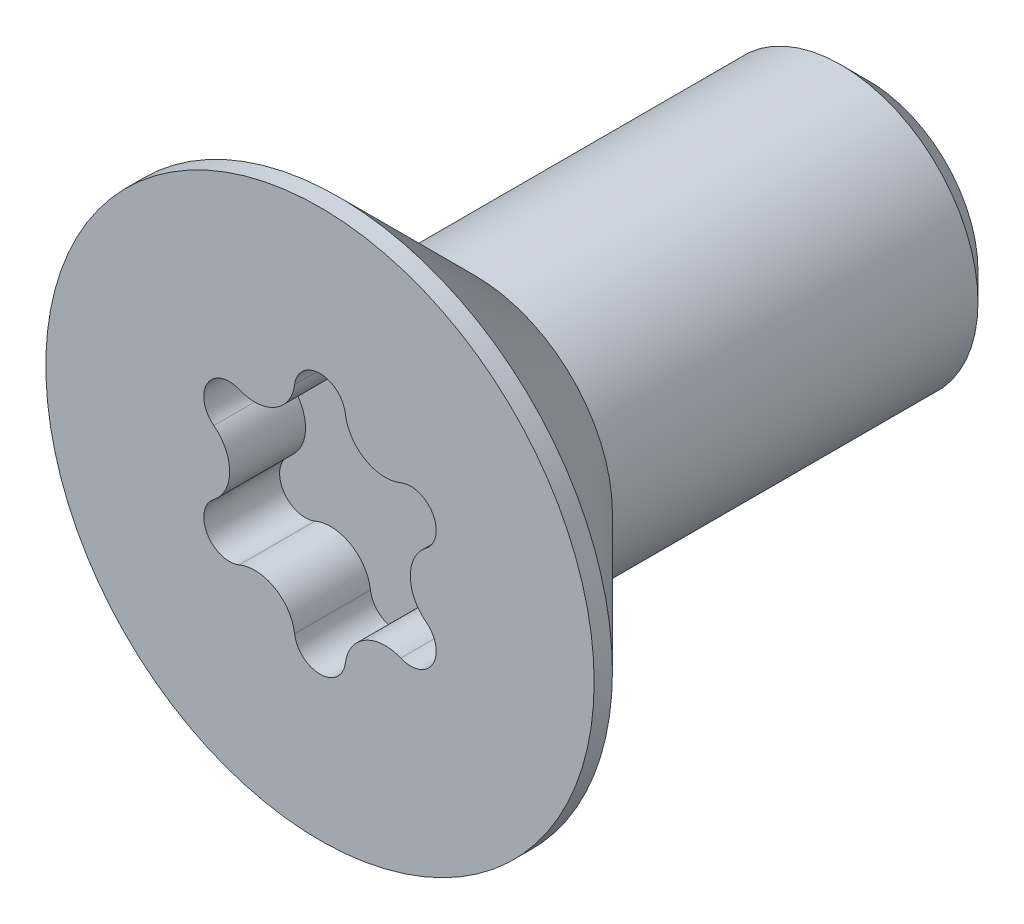
ISO-10303-21;
HEADER;
FILE_DESCRIPTION(('STEP AP214'),'2;1');
FILE_NAME('part.step','',(''),(''),'','','');
FILE_SCHEMA(('AUTOMOTIVE_DESIGN { 1 0 10303 214 1 1 1 1 }'));
ENDSEC;
DATA;
#1=APPLICATION_CONTEXT('core data for automotive mechanical design processes');
#2=APPLICATION_PROTOCOL_DEFINITION('international standard','automotive_design',2000,#1);
#3=PRODUCT_CONTEXT('',#1,'mechanical');
#4=PRODUCT('Part','Part','',(#3));
#5=PRODUCT_RELATED_PRODUCT_CATEGORY('part','',(#4));
#6=PRODUCT_DEFINITION_FORMATION('','',#4);
#7=PRODUCT_DEFINITION_CONTEXT('part definition',#1,'design');
#8=PRODUCT_DEFINITION('design','',#6,#7);
#9=PRODUCT_DEFINITION_SHAPE('','',#8);
#10=(LENGTH_UNIT() NAMED_UNIT(*) SI_UNIT(.MILLI.,.METRE.));
#11=(NAMED_UNIT(*) PLANE_ANGLE_UNIT() SI_UNIT($,.RADIAN.));
#12=(NAMED_UNIT(*) SI_UNIT($,.STERADIAN.) SOLID_ANGLE_UNIT());
#13=UNCERTAINTY_MEASURE_WITH_UNIT(LENGTH_MEASURE(1.E-05),#10,'distance_accuracy_value','');
#14=(GEOMETRIC_REPRESENTATION_CONTEXT(3) GLOBAL_UNCERTAINTY_ASSIGNED_CONTEXT((#13)) GLOBAL_UNIT_ASSIGNED_CONTEXT((#10,
#11,#12)) REPRESENTATION_CONTEXT('',''));
#15=CARTESIAN_POINT('',(0.,0.,0.));
#16=DIRECTION('',(0.,0.,1.));
#17=DIRECTION('',(1.,0.,0.));
#18=AXIS2_PLACEMENT_3D('',#15,#16,#17);
#19=CARTESIAN_POINT('',(0.,0.,1.7));
#20=DIRECTION('',(0.,0.,1.));
#21=DIRECTION('',(1.,0.,0.));
#22=AXIS2_PLACEMENT_3D('',#19,#20,#21);
#23=PLANE('',#22);
#24=CARTESIAN_POINT('',(0.,0.,1.7));
#25=DIRECTION('',(0.,0.,1.));
#26=DIRECTION('',(1.,0.,0.));
#27=AXIS2_PLACEMENT_3D('',#24,#25,#26);
#28=CIRCLE('',#27,3.);
#29=CARTESIAN_POINT('',(3.,0.,1.7));
#30=VERTEX_POINT('',#29);
#31=EDGE_CURVE('E11',#30,#30,#28,.T.);
#32=ORIENTED_EDGE('',*,*,#31,.T.);
#33=EDGE_LOOP('',(#32));
#34=FACE_BOUND('',#33,.T.);
#35=CARTESIAN_POINT('',(0.,-1.145,1.7));
#36=DIRECTION('',(0.,0.,-1.));
#37=DIRECTION('',(1.,0.,0.));
#38=AXIS2_PLACEMENT_3D('',#35,#36,#37);
#39=CIRCLE('',#38,0.28);
#40=CARTESIAN_POINT('',(0.277710764558,-1.180731376246,1.7));
#41=VERTEX_POINT('',#40);
#42=CARTESIAN_POINT('',(-0.277710764558,-1.180731376246,1.7));
#43=VERTEX_POINT('',#42);
#44=EDGE_CURVE('E27',#41,#43,#39,.T.);
#45=ORIENTED_EDGE('',*,*,#44,.T.);
#46=CARTESIAN_POINT('',(-0.714113394579,-1.236880681775,1.7));
#47=DIRECTION('',(0.,0.,1.));
#48=DIRECTION('',(1.,0.,0.));
#49=AXIS2_PLACEMENT_3D('',#46,#47,#48);
#50=CIRCLE('',#49,0.44);
#51=CARTESIAN_POINT('',(-0.883687984595,-0.830870265135,1.7));
#52=VERTEX_POINT('',#51);
#53=EDGE_CURVE('E215',#43,#52,#50,.T.);
#54=ORIENTED_EDGE('',*,*,#53,.T.);
#55=CARTESIAN_POINT('',(-0.991599087333,-0.5725,1.7));
#56=DIRECTION('',(0.,0.,-1.));
#57=DIRECTION('',(1.,0.,0.));
#58=AXIS2_PLACEMENT_3D('',#55,#56,#57);
#59=CIRCLE('',#58,0.28);
#60=CARTESIAN_POINT('',(-1.161398749154,-0.349861111111,1.7));
#61=VERTEX_POINT('',#60);
#62=EDGE_CURVE('E211',#52,#61,#59,.T.);
#63=ORIENTED_EDGE('',*,*,#62,.T.);
#64=CARTESIAN_POINT('',(-1.428226789157,0.,1.7));
#65=DIRECTION('',(0.,0.,1.));
#66=DIRECTION('',(1.,0.,0.));
#67=AXIS2_PLACEMENT_3D('',#64,#65,#66);
#68=CIRCLE('',#67,0.44);
#69=CARTESIAN_POINT('',(-1.161398749154,0.349861111111,1.7));
#70=VERTEX_POINT('',#69);
#71=EDGE_CURVE('E216',#61,#70,#68,.T.);
#72=ORIENTED_EDGE('',*,*,#71,.T.);
#73=CARTESIAN_POINT('',(-0.991599087333,0.5725,1.7));
#74=DIRECTION('',(0.,0.,-1.));
#75=DIRECTION('',(1.,0.,0.));
#76=AXIS2_PLACEMENT_3D('',#73,#74,#75);
#77=CIRCLE('',#76,0.28);
#78=CARTESIAN_POINT('',(-0.883687984595,0.830870265135,1.7));
#79=VERTEX_POINT('',#78);
#80=EDGE_CURVE('E219',#70,#79,#77,.T.);
#81=ORIENTED_EDGE('',*,*,#80,.T.);
#82=CARTESIAN_POINT('',(-0.714113394579,1.236880681775,1.7));
#83=DIRECTION('',(0.,0.,1.));
#84=DIRECTION('',(1.,0.,0.));
#85=AXIS2_PLACEMENT_3D('',#82,#83,#84);
#86=CIRCLE('',#85,0.44);
#87=CARTESIAN_POINT('',(-0.277710764558,1.180731376246,1.7));
#88=VERTEX_POINT('',#87);
#89=EDGE_CURVE('E143',#79,#88,#86,.T.);
#90=ORIENTED_EDGE('',*,*,#89,.T.);
#91=CARTESIAN_POINT('',(0.,1.145,1.7));
#92=DIRECTION('',(0.,0.,-1.));
#93=DIRECTION('',(1.,0.,0.));
#94=AXIS2_PLACEMENT_3D('',#91,#92,#93);
#95=CIRCLE('',#94,0.28);
#96=CARTESIAN_POINT('',(0.277710764558,1.180731376246,1.7));
#97=VERTEX_POINT('',#96);
#98=EDGE_CURVE('E132',#88,#97,#95,.T.);
#99=ORIENTED_EDGE('',*,*,#98,.T.);
#100=CARTESIAN_POINT('',(0.714113394579,1.236880681775,1.7));
#101=DIRECTION('',(0.,0.,1.));
#102=DIRECTION('',(1.,0.,0.));
#103=AXIS2_PLACEMENT_3D('',#100,#101,#102);
#104=CIRCLE('',#103,0.44);
#105=CARTESIAN_POINT('',(0.883687984595,0.830870265135,1.7));
#106=VERTEX_POINT('',#105);
#107=EDGE_CURVE('E246',#97,#106,#104,.T.);
#108=ORIENTED_EDGE('',*,*,#107,.T.);
#109=CARTESIAN_POINT('',(0.991599087333,0.5725,1.7));
#110=DIRECTION('',(0.,0.,-1.));
#111=DIRECTION('',(1.,0.,0.));
#112=AXIS2_PLACEMENT_3D('',#109,#110,#111);
#113=CIRCLE('',#112,0.28);
#114=CARTESIAN_POINT('',(1.161398749154,0.349861111111,1.7));
#115=VERTEX_POINT('',#114);
#116=EDGE_CURVE('E167',#106,#115,#113,.T.);
#117=ORIENTED_EDGE('',*,*,#116,.T.);
#118=CARTESIAN_POINT('',(1.428226789157,0.,1.7));
#119=DIRECTION('',(0.,0.,1.));
#120=DIRECTION('',(1.,0.,0.));
#121=AXIS2_PLACEMENT_3D('',#118,#119,#120);
#122=CIRCLE('',#121,0.44);
#123=CARTESIAN_POINT('',(1.161398749154,-0.349861111111,1.7));
#124=VERTEX_POINT('',#123);
#125=EDGE_CURVE('E247',#115,#124,#122,.T.);
#126=ORIENTED_EDGE('',*,*,#125,.T.);
#127=CARTESIAN_POINT('',(0.991599087333,-0.5725,1.7));
#128=DIRECTION('',(0.,0.,-1.));
#129=DIRECTION('',(1.,0.,0.));
#130=AXIS2_PLACEMENT_3D('',#127,#128,#129);
#131=CIRCLE('',#130,0.28);
#132=CARTESIAN_POINT('',(0.883687984595,-0.830870265135,1.7));
#133=VERTEX_POINT('',#132);
#134=EDGE_CURVE('E229',#124,#133,#131,.T.);
#135=ORIENTED_EDGE('',*,*,#134,.T.);
#136=CARTESIAN_POINT('',(0.714113394579,-1.236880681775,1.7));
#137=DIRECTION('',(0.,0.,1.));
#138=DIRECTION('',(1.,0.,0.));
#139=AXIS2_PLACEMENT_3D('',#136,#137,#138);
#140=CIRCLE('',#139,0.44);
#141=EDGE_CURVE('E226',#133,#41,#140,.T.);
#142=ORIENTED_EDGE('',*,*,#141,.T.);
#143=EDGE_LOOP('',(#45,#54,#63,#72,#81,#90,#99,#108,#117,#126,#135,#142));
#144=FACE_BOUND('',#143,.T.);
#145=ADVANCED_FACE('F16',(#34,#144),#23,.T.);
#146=CARTESIAN_POINT('',(0.,0.,1.7));
#147=DIRECTION('',(0.,0.,-1.));
#148=DIRECTION('',(1.,0.,0.));
#149=AXIS2_PLACEMENT_3D('',#146,#147,#148);
#150=CYLINDRICAL_SURFACE('',#149,3.);
#151=DIRECTION('',(0.,0.,-1.));
#152=VECTOR('',#151,1.);
#153=CARTESIAN_POINT('',(3.,0.,1.7));
#154=LINE('',#153,#152);
#155=CARTESIAN_POINT('',(3.,0.,1.5));
#156=VERTEX_POINT('',#155);
#157=EDGE_CURVE('E230',#30,#156,#154,.T.);
#158=ORIENTED_EDGE('',*,*,#157,.T.);
#159=CARTESIAN_POINT('',(0.,0.,1.5));
#160=DIRECTION('',(0.,0.,1.));
#161=DIRECTION('',(1.,0.,0.));
#162=AXIS2_PLACEMENT_3D('',#159,#160,#161);
#163=CIRCLE('',#162,3.);
#164=EDGE_CURVE('E299',#156,#156,#163,.T.);
#165=ORIENTED_EDGE('',*,*,#164,.T.);
#166=ORIENTED_EDGE('',*,*,#157,.F.);
#167=ORIENTED_EDGE('',*,*,#31,.F.);
#168=EDGE_LOOP('',(#158,#165,#166,#167));
#169=FACE_BOUND('',#168,.T.);
#170=ADVANCED_FACE('F376',(#169),#150,.T.);
#171=CARTESIAN_POINT('',(0.714113394579,-1.236880681775,0.87));
#172=DIRECTION('',(0.,0.,-1.));
#173=DIRECTION('',(1.,0.,0.));
#174=AXIS2_PLACEMENT_3D('',#171,#172,#173);
#175=CYLINDRICAL_SURFACE('',#174,0.44);
#176=CARTESIAN_POINT('',(0.714113394579,-1.236880681775,0.87));
#177=DIRECTION('',(0.,0.,1.));
#178=DIRECTION('',(1.,0.,0.));
#179=AXIS2_PLACEMENT_3D('',#176,#177,#178);
#180=CIRCLE('',#179,0.44);
#181=CARTESIAN_POINT('',(0.883687984595,-0.830870265135,0.87));
#182=VERTEX_POINT('',#181);
#183=CARTESIAN_POINT('',(0.277710764558,-1.180731376246,0.87));
#184=VERTEX_POINT('',#183);
#185=EDGE_CURVE('E223',#182,#184,#180,.T.);
#186=ORIENTED_EDGE('',*,*,#185,.T.);
#187=DIRECTION('',(0.,0.,1.));
#188=VECTOR('',#187,1.);
#189=CARTESIAN_POINT('',(0.277710764558,-1.180731376246,0.87));
#190=LINE('',#189,#188);
#191=EDGE_CURVE('E220',#184,#41,#190,.T.);
#192=ORIENTED_EDGE('',*,*,#191,.T.);
#193=ORIENTED_EDGE('',*,*,#141,.F.);
#194=DIRECTION('',(0.,0.,1.));
#195=VECTOR('',#194,1.);
#196=CARTESIAN_POINT('',(0.883687984595,-0.830870265135,0.87));
#197=LINE('',#196,#195);
#198=EDGE_CURVE('E243',#182,#133,#197,.T.);
#199=ORIENTED_EDGE('',*,*,#198,.F.);
#200=EDGE_LOOP('',(#186,#192,#193,#199));
#201=FACE_BOUND('',#200,.T.);
#202=ADVANCED_FACE('F353',(#201),#175,.T.);
#203=CARTESIAN_POINT('',(0.,-1.145,0.87));
#204=DIRECTION('',(0.,0.,-1.));
#205=DIRECTION('',(1.,0.,0.));
#206=AXIS2_PLACEMENT_3D('',#203,#204,#205);
#207=CYLINDRICAL_SURFACE('',#206,0.28);
#208=CARTESIAN_POINT('',(0.,-1.145,0.87));
#209=DIRECTION('',(0.,0.,-1.));
#210=DIRECTION('',(1.,0.,0.));
#211=AXIS2_PLACEMENT_3D('',#208,#209,#210);
#212=CIRCLE('',#211,0.28);
#213=CARTESIAN_POINT('',(-0.277710764558,-1.180731376246,0.87));
#214=VERTEX_POINT('',#213);
#215=EDGE_CURVE('E224',#184,#214,#212,.T.);
#216=ORIENTED_EDGE('',*,*,#215,.T.);
#217=DIRECTION('',(0.,0.,1.));
#218=VECTOR('',#217,1.);
#219=CARTESIAN_POINT('',(-0.277710764558,-1.180731376246,0.87));
#220=LINE('',#219,#218);
#221=EDGE_CURVE('E287',#214,#43,#220,.T.);
#222=ORIENTED_EDGE('',*,*,#221,.T.);
#223=ORIENTED_EDGE('',*,*,#44,.F.);
#224=ORIENTED_EDGE('',*,*,#191,.F.);
#225=EDGE_LOOP('',(#216,#222,#223,#224));
#226=FACE_BOUND('',#225,.T.);
#227=ADVANCED_FACE('F18',(#226),#207,.F.);
#228=CARTESIAN_POINT('',(-0.714113394579,-1.236880681775,0.87));
#229=DIRECTION('',(0.,0.,-1.));
#230=DIRECTION('',(1.,0.,0.));
#231=AXIS2_PLACEMENT_3D('',#228,#229,#230);
#232=CYLINDRICAL_SURFACE('',#231,0.44);
#233=CARTESIAN_POINT('',(-0.714113394579,-1.236880681775,0.87));
#234=DIRECTION('',(0.,0.,1.));
#235=DIRECTION('',(1.,0.,0.));
#236=AXIS2_PLACEMENT_3D('',#233,#234,#235);
#237=CIRCLE('',#236,0.44);
#238=CARTESIAN_POINT('',(-0.883687984595,-0.830870265135,0.87));
#239=VERTEX_POINT('',#238);
#240=EDGE_CURVE('E279',#214,#239,#237,.T.);
#241=ORIENTED_EDGE('',*,*,#240,.T.);
#242=DIRECTION('',(0.,0.,1.));
#243=VECTOR('',#242,1.);
#244=CARTESIAN_POINT('',(-0.883687984595,-0.830870265135,0.87));
#245=LINE('',#244,#243);
#246=EDGE_CURVE('E195',#239,#52,#245,.T.);
#247=ORIENTED_EDGE('',*,*,#246,.T.);
#248=ORIENTED_EDGE('',*,*,#53,.F.);
#249=ORIENTED_EDGE('',*,*,#221,.F.);
#250=EDGE_LOOP('',(#241,#247,#248,#249));
#251=FACE_BOUND('',#250,.T.);
#252=ADVANCED_FACE('F277',(#251),#232,.T.);
#253=CARTESIAN_POINT('',(-0.991599087333,-0.5725,0.87));
#254=DIRECTION('',(0.,0.,-1.));
#255=DIRECTION('',(1.,0.,0.));
#256=AXIS2_PLACEMENT_3D('',#253,#254,#255);
#257=CYLINDRICAL_SURFACE('',#256,0.28);
#258=CARTESIAN_POINT('',(-0.991599087333,-0.5725,0.87));
#259=DIRECTION('',(0.,0.,-1.));
#260=DIRECTION('',(1.,0.,0.));
#261=AXIS2_PLACEMENT_3D('',#258,#259,#260);
#262=CIRCLE('',#261,0.28);
#263=CARTESIAN_POINT('',(-1.161398749154,-0.349861111111,0.87));
#264=VERTEX_POINT('',#263);
#265=EDGE_CURVE('E283',#239,#264,#262,.T.);
#266=ORIENTED_EDGE('',*,*,#265,.T.);
#267=DIRECTION('',(0.,0.,1.));
#268=VECTOR('',#267,1.);
#269=CARTESIAN_POINT('',(-1.161398749154,-0.349861111111,0.87));
#270=LINE('',#269,#268);
#271=EDGE_CURVE('E237',#264,#61,#270,.T.);
#272=ORIENTED_EDGE('',*,*,#271,.T.);
#273=ORIENTED_EDGE('',*,*,#62,.F.);
#274=ORIENTED_EDGE('',*,*,#246,.F.);
#275=EDGE_LOOP('',(#266,#272,#273,#274));
#276=FACE_BOUND('',#275,.T.);
#277=ADVANCED_FACE('F396',(#276),#257,.F.);
#278=CARTESIAN_POINT('',(-1.428226789157,0.,0.87));
#279=DIRECTION('',(0.,0.,-1.));
#280=DIRECTION('',(1.,0.,0.));
#281=AXIS2_PLACEMENT_3D('',#278,#279,#280);
#282=CYLINDRICAL_SURFACE('',#281,0.44);
#283=CARTESIAN_POINT('',(-1.428226789157,0.,0.87));
#284=DIRECTION('',(0.,0.,1.));
#285=DIRECTION('',(1.,0.,0.));
#286=AXIS2_PLACEMENT_3D('',#283,#284,#285);
#287=CIRCLE('',#286,0.44);
#288=CARTESIAN_POINT('',(-1.161398749154,0.349861111111,0.87));
#289=VERTEX_POINT('',#288);
#290=EDGE_CURVE('E233',#264,#289,#287,.T.);
#291=ORIENTED_EDGE('',*,*,#290,.T.);
#292=DIRECTION('',(0.,0.,1.));
#293=VECTOR('',#292,1.);
#294=CARTESIAN_POINT('',(-1.161398749154,0.349861111111,0.87));
#295=LINE('',#294,#293);
#296=EDGE_CURVE('E238',#289,#70,#295,.T.);
#297=ORIENTED_EDGE('',*,*,#296,.T.);
#298=ORIENTED_EDGE('',*,*,#71,.F.);
#299=ORIENTED_EDGE('',*,*,#271,.F.);
#300=EDGE_LOOP('',(#291,#297,#298,#299));
#301=FACE_BOUND('',#300,.T.);
#302=ADVANCED_FACE('F348',(#301),#282,.T.);
#303=CARTESIAN_POINT('',(-0.991599087333,0.5725,0.87));
#304=DIRECTION('',(0.,0.,-1.));
#305=DIRECTION('',(1.,0.,0.));
#306=AXIS2_PLACEMENT_3D('',#303,#304,#305);
#307=CYLINDRICAL_SURFACE('',#306,0.28);
#308=CARTESIAN_POINT('',(-0.991599087333,0.5725,0.87));
#309=DIRECTION('',(0.,0.,-1.));
#310=DIRECTION('',(1.,0.,0.));
#311=AXIS2_PLACEMENT_3D('',#308,#309,#310);
#312=CIRCLE('',#311,0.28);
#313=CARTESIAN_POINT('',(-0.883687984595,0.830870265135,0.87));
#314=VERTEX_POINT('',#313);
#315=EDGE_CURVE('E304',#289,#314,#312,.T.);
#316=ORIENTED_EDGE('',*,*,#315,.T.);
#317=DIRECTION('',(0.,0.,1.));
#318=VECTOR('',#317,1.);
#319=CARTESIAN_POINT('',(-0.883687984595,0.830870265135,0.87));
#320=LINE('',#319,#318);
#321=EDGE_CURVE('E252',#314,#79,#320,.T.);
#322=ORIENTED_EDGE('',*,*,#321,.T.);
#323=ORIENTED_EDGE('',*,*,#80,.F.);
#324=ORIENTED_EDGE('',*,*,#296,.F.);
#325=EDGE_LOOP('',(#316,#322,#323,#324));
#326=FACE_BOUND('',#325,.T.);
#327=ADVANCED_FACE('F346',(#326),#307,.F.);
#328=CARTESIAN_POINT('',(-0.714113394579,1.236880681775,0.87));
#329=DIRECTION('',(0.,0.,-1.));
#330=DIRECTION('',(1.,0.,0.));
#331=AXIS2_PLACEMENT_3D('',#328,#329,#330);
#332=CYLINDRICAL_SURFACE('',#331,0.44);
#333=CARTESIAN_POINT('',(-0.714113394579,1.236880681775,0.87));
#334=DIRECTION('',(0.,0.,1.));
#335=DIRECTION('',(1.,0.,0.));
#336=AXIS2_PLACEMENT_3D('',#333,#334,#335);
#337=CIRCLE('',#336,0.44);
#338=CARTESIAN_POINT('',(-0.277710764558,1.180731376246,0.87));
#339=VERTEX_POINT('',#338);
#340=EDGE_CURVE('E248',#314,#339,#337,.T.);
#341=ORIENTED_EDGE('',*,*,#340,.T.);
#342=DIRECTION('',(0.,0.,1.));
#343=VECTOR('',#342,1.);
#344=CARTESIAN_POINT('',(-0.277710764558,1.180731376246,0.87));
#345=LINE('',#344,#343);
#346=EDGE_CURVE('E253',#339,#88,#345,.T.);
#347=ORIENTED_EDGE('',*,*,#346,.T.);
#348=ORIENTED_EDGE('',*,*,#89,.F.);
#349=ORIENTED_EDGE('',*,*,#321,.F.);
#350=EDGE_LOOP('',(#341,#347,#348,#349));
#351=FACE_BOUND('',#350,.T.);
#352=ADVANCED_FACE('F344',(#351),#332,.T.);
#353=CARTESIAN_POINT('',(0.,1.145,0.87));
#354=DIRECTION('',(0.,0.,-1.));
#355=DIRECTION('',(1.,0.,0.));
#356=AXIS2_PLACEMENT_3D('',#353,#354,#355);
#357=CYLINDRICAL_SURFACE('',#356,0.28);
#358=CARTESIAN_POINT('',(0.,1.145,0.87));
#359=DIRECTION('',(0.,0.,-1.));
#360=DIRECTION('',(1.,0.,0.));
#361=AXIS2_PLACEMENT_3D('',#358,#359,#360);
#362=CIRCLE('',#361,0.28);
#363=CARTESIAN_POINT('',(0.277710764558,1.180731376246,0.87));
#364=VERTEX_POINT('',#363);
#365=EDGE_CURVE('E326',#339,#364,#362,.T.);
#366=ORIENTED_EDGE('',*,*,#365,.T.);
#367=DIRECTION('',(0.,0.,1.));
#368=VECTOR('',#367,1.);
#369=CARTESIAN_POINT('',(0.277710764558,1.180731376246,0.87));
#370=LINE('',#369,#368);
#371=EDGE_CURVE('E175',#364,#97,#370,.T.);
#372=ORIENTED_EDGE('',*,*,#371,.T.);
#373=ORIENTED_EDGE('',*,*,#98,.F.);
#374=ORIENTED_EDGE('',*,*,#346,.F.);
#375=EDGE_LOOP('',(#366,#372,#373,#374));
#376=FACE_BOUND('',#375,.T.);
#377=ADVANCED_FACE('F341',(#376),#357,.F.);
#378=CARTESIAN_POINT('',(0.714113394579,1.236880681775,0.87));
#379=DIRECTION('',(0.,0.,-1.));
#380=DIRECTION('',(1.,0.,0.));
#381=AXIS2_PLACEMENT_3D('',#378,#379,#380);
#382=CYLINDRICAL_SURFACE('',#381,0.44);
#383=CARTESIAN_POINT('',(0.714113394579,1.236880681775,0.87));
#384=DIRECTION('',(0.,0.,1.));
#385=DIRECTION('',(1.,0.,0.));
#386=AXIS2_PLACEMENT_3D('',#383,#384,#385);
#387=CIRCLE('',#386,0.44);
#388=CARTESIAN_POINT('',(0.883687984595,0.830870265135,0.87));
#389=VERTEX_POINT('',#388);
#390=EDGE_CURVE('E171',#364,#389,#387,.T.);
#391=ORIENTED_EDGE('',*,*,#390,.T.);
#392=DIRECTION('',(0.,0.,1.));
#393=VECTOR('',#392,1.);
#394=CARTESIAN_POINT('',(0.883687984595,0.830870265135,0.87));
#395=LINE('',#394,#393);
#396=EDGE_CURVE('E159',#389,#106,#395,.T.);
#397=ORIENTED_EDGE('',*,*,#396,.T.);
#398=ORIENTED_EDGE('',*,*,#107,.F.);
#399=ORIENTED_EDGE('',*,*,#371,.F.);
#400=EDGE_LOOP('',(#391,#397,#398,#399));
#401=FACE_BOUND('',#400,.T.);
#402=ADVANCED_FACE('F174',(#401),#382,.T.);
#403=CARTESIAN_POINT('',(0.991599087333,0.5725,0.87));
#404=DIRECTION('',(0.,0.,-1.));
#405=DIRECTION('',(1.,0.,0.));
#406=AXIS2_PLACEMENT_3D('',#403,#404,#405);
#407=CYLINDRICAL_SURFACE('',#406,0.28);
#408=CARTESIAN_POINT('',(0.991599087333,0.5725,0.87));
#409=DIRECTION('',(0.,0.,-1.));
#410=DIRECTION('',(1.,0.,0.));
#411=AXIS2_PLACEMENT_3D('',#408,#409,#410);
#412=CIRCLE('',#411,0.28);
#413=CARTESIAN_POINT('',(1.161398749154,0.349861111111,0.87));
#414=VERTEX_POINT('',#413);
#415=EDGE_CURVE('E164',#389,#414,#412,.T.);
#416=ORIENTED_EDGE('',*,*,#415,.T.);
#417=DIRECTION('',(0.,0.,1.));
#418=VECTOR('',#417,1.);
#419=CARTESIAN_POINT('',(1.161398749154,0.349861111111,0.87));
#420=LINE('',#419,#418);
#421=EDGE_CURVE('E186',#414,#115,#420,.T.);
#422=ORIENTED_EDGE('',*,*,#421,.T.);
#423=ORIENTED_EDGE('',*,*,#116,.F.);
#424=ORIENTED_EDGE('',*,*,#396,.F.);
#425=EDGE_LOOP('',(#416,#422,#423,#424));
#426=FACE_BOUND('',#425,.T.);
#427=ADVANCED_FACE('F161',(#426),#407,.F.);
#428=CARTESIAN_POINT('',(1.428226789157,0.,0.87));
#429=DIRECTION('',(0.,0.,-1.));
#430=DIRECTION('',(1.,0.,0.));
#431=AXIS2_PLACEMENT_3D('',#428,#429,#430);
#432=CYLINDRICAL_SURFACE('',#431,0.44);
#433=CARTESIAN_POINT('',(1.428226789157,0.,0.87));
#434=DIRECTION('',(0.,0.,1.));
#435=DIRECTION('',(1.,0.,0.));
#436=AXIS2_PLACEMENT_3D('',#433,#434,#435);
#437=CIRCLE('',#436,0.44);
#438=CARTESIAN_POINT('',(1.161398749154,-0.349861111111,0.87));
#439=VERTEX_POINT('',#438);
#440=EDGE_CURVE('E184',#414,#439,#437,.T.);
#441=ORIENTED_EDGE('',*,*,#440,.T.);
#442=DIRECTION('',(0.,0.,1.));
#443=VECTOR('',#442,1.);
#444=CARTESIAN_POINT('',(1.161398749154,-0.349861111111,0.87));
#445=LINE('',#444,#443);
#446=EDGE_CURVE('E197',#439,#124,#445,.T.);
#447=ORIENTED_EDGE('',*,*,#446,.T.);
#448=ORIENTED_EDGE('',*,*,#125,.F.);
#449=ORIENTED_EDGE('',*,*,#421,.F.);
#450=EDGE_LOOP('',(#441,#447,#448,#449));
#451=FACE_BOUND('',#450,.T.);
#452=ADVANCED_FACE('F358',(#451),#432,.T.);
#453=CARTESIAN_POINT('',(0.991599087333,-0.5725,0.87));
#454=DIRECTION('',(0.,0.,-1.));
#455=DIRECTION('',(1.,0.,0.));
#456=AXIS2_PLACEMENT_3D('',#453,#454,#455);
#457=CYLINDRICAL_SURFACE('',#456,0.28);
#458=CARTESIAN_POINT('',(0.991599087333,-0.5725,0.87));
#459=DIRECTION('',(0.,0.,-1.));
#460=DIRECTION('',(1.,0.,0.));
#461=AXIS2_PLACEMENT_3D('',#458,#459,#460);
#462=CIRCLE('',#461,0.28);
#463=EDGE_CURVE('E200',#439,#182,#462,.T.);
#464=ORIENTED_EDGE('',*,*,#463,.T.);
#465=ORIENTED_EDGE('',*,*,#198,.T.);
#466=ORIENTED_EDGE('',*,*,#134,.F.);
#467=ORIENTED_EDGE('',*,*,#446,.F.);
#468=EDGE_LOOP('',(#464,#465,#466,#467));
#469=FACE_BOUND('',#468,.T.);
#470=ADVANCED_FACE('F355',(#469),#457,.F.);
#471=CARTESIAN_POINT('',(0.,0.,1.5));
#472=DIRECTION('',(0.,0.,1.));
#473=DIRECTION('',(1.,0.,0.));
#474=AXIS2_PLACEMENT_3D('',#471,#472,#473);
#475=CONICAL_SURFACE('',#474,3.,0.785398163397);
#476=DIRECTION('',(-0.707106781186548,0.,-0.707106781186548));
#477=VECTOR('',#476,1.);
#478=CARTESIAN_POINT('',(3.,0.,1.5));
#479=LINE('',#478,#477);
#480=CARTESIAN_POINT('',(1.5,0.,0.));
#481=VERTEX_POINT('',#480);
#482=EDGE_CURVE('E239',#156,#481,#479,.T.);
#483=ORIENTED_EDGE('',*,*,#482,.T.);
#484=CARTESIAN_POINT('',(0.,0.,0.));
#485=DIRECTION('',(0.,0.,1.));
#486=DIRECTION('',(1.,0.,0.));
#487=AXIS2_PLACEMENT_3D('',#484,#485,#486);
#488=CIRCLE('',#487,1.5);
#489=EDGE_CURVE('E205',#481,#481,#488,.T.);
#490=ORIENTED_EDGE('',*,*,#489,.T.);
#491=ORIENTED_EDGE('',*,*,#482,.F.);
#492=ORIENTED_EDGE('',*,*,#164,.F.);
#493=EDGE_LOOP('',(#483,#490,#491,#492));
#494=FACE_BOUND('',#493,.T.);
#495=ADVANCED_FACE('F370',(#494),#475,.T.);
#496=CARTESIAN_POINT('',(0.,0.,0.87));
#497=DIRECTION('',(0.,0.,1.));
#498=DIRECTION('',(1.,0.,0.));
#499=AXIS2_PLACEMENT_3D('',#496,#497,#498);
#500=PLANE('',#499);
#501=ORIENTED_EDGE('',*,*,#463,.F.);
#502=ORIENTED_EDGE('',*,*,#440,.F.);
#503=ORIENTED_EDGE('',*,*,#415,.F.);
#504=ORIENTED_EDGE('',*,*,#390,.F.);
#505=ORIENTED_EDGE('',*,*,#365,.F.);
#506=ORIENTED_EDGE('',*,*,#340,.F.);
#507=ORIENTED_EDGE('',*,*,#315,.F.);
#508=ORIENTED_EDGE('',*,*,#290,.F.);
#509=ORIENTED_EDGE('',*,*,#265,.F.);
#510=ORIENTED_EDGE('',*,*,#240,.F.);
#511=ORIENTED_EDGE('',*,*,#215,.F.);
#512=ORIENTED_EDGE('',*,*,#185,.F.);
#513=EDGE_LOOP('',(#501,#502,#503,#504,#505,#506,#507,#508,#509,#510,#511,#512));
#514=FACE_BOUND('',#513,.T.);
#515=ADVANCED_FACE('F182',(#514),#500,.T.);
#516=CARTESIAN_POINT('',(0.,0.,-4.000000000015));
#517=DIRECTION('',(0.,0.,1.));
#518=DIRECTION('',(1.,0.,0.));
#519=AXIS2_PLACEMENT_3D('',#516,#517,#518);
#520=CYLINDRICAL_SURFACE('',#519,1.5);
#521=CARTESIAN_POINT('',(0.,0.,-4.000000000015));
#522=DIRECTION('',(0.,0.,1.));
#523=DIRECTION('',(1.,0.,0.));
#524=AXIS2_PLACEMENT_3D('',#521,#522,#523);
#525=CIRCLE('',#524,1.5);
#526=CARTESIAN_POINT('',(1.5,0.,-4.000000000015));
#527=VERTEX_POINT('',#526);
#528=EDGE_CURVE('E201',#527,#527,#525,.T.);
#529=ORIENTED_EDGE('',*,*,#528,.T.);
#530=DIRECTION('',(0.,0.,1.));
#531=VECTOR('',#530,1.);
#532=CARTESIAN_POINT('',(1.5,0.,-4.000000000015));
#533=LINE('',#532,#531);
#534=EDGE_CURVE('E20',#527,#481,#533,.T.);
#535=ORIENTED_EDGE('',*,*,#534,.T.);
#536=ORIENTED_EDGE('',*,*,#489,.F.);
#537=ORIENTED_EDGE('',*,*,#534,.F.);
#538=EDGE_LOOP('',(#529,#535,#536,#537));
#539=FACE_BOUND('',#538,.T.);
#540=ADVANCED_FACE('F398',(#539),#520,.T.);
#541=CARTESIAN_POINT('',(0.,0.,-4.3));
#542=DIRECTION('',(0.,0.,1.));
#543=DIRECTION('',(1.,0.,0.));
#544=AXIS2_PLACEMENT_3D('',#541,#542,#543);
#545=CONICAL_SURFACE('',#544,1.2,0.785398163423);
#546=CARTESIAN_POINT('',(0.,0.,-4.3));
#547=DIRECTION('',(0.,0.,1.));
#548=DIRECTION('',(1.,0.,0.));
#549=AXIS2_PLACEMENT_3D('',#546,#547,#548);
#550=CIRCLE('',#549,1.2);
#551=CARTESIAN_POINT('',(1.2,0.,-4.3));
#552=VERTEX_POINT('',#551);
#553=EDGE_CURVE('E206',#552,#552,#550,.T.);
#554=ORIENTED_EDGE('',*,*,#553,.T.);
#555=DIRECTION('',(0.707106781204048,0.,0.707106781169048));
#556=VECTOR('',#555,1.);
#557=CARTESIAN_POINT('',(1.2,0.,-4.3));
#558=LINE('',#557,#556);
#559=EDGE_CURVE('E209',#552,#527,#558,.T.);
#560=ORIENTED_EDGE('',*,*,#559,.T.);
#561=ORIENTED_EDGE('',*,*,#528,.F.);
#562=ORIENTED_EDGE('',*,*,#559,.F.);
#563=EDGE_LOOP('',(#554,#560,#561,#562));
#564=FACE_BOUND('',#563,.T.);
#565=ADVANCED_FACE('F459',(#564),#545,.T.);
#566=CARTESIAN_POINT('',(0.,0.,-4.3));
#567=DIRECTION('',(0.,0.,1.));
#568=DIRECTION('',(1.,0.,0.));
#569=AXIS2_PLACEMENT_3D('',#566,#567,#568);
#570=PLANE('',#569);
#571=ORIENTED_EDGE('',*,*,#553,.F.);
#572=EDGE_LOOP('',(#571));
#573=FACE_BOUND('',#572,.T.);
#574=ADVANCED_FACE('F384',(#573),#570,.F.);
#575=CLOSED_SHELL('',(#145,#170,#202,#227,#252,#277,#302,#327,#352,#377,#402,#427,#452,#470,
#495,#515,#540,#565,#574));
#576=MANIFOLD_SOLID_BREP('B1',#575);
#577=ADVANCED_BREP_SHAPE_REPRESENTATION('',(#18,#576),#14);
#578=SHAPE_DEFINITION_REPRESENTATION(#9,#577);
ENDSEC;
END-ISO-10303-21;
